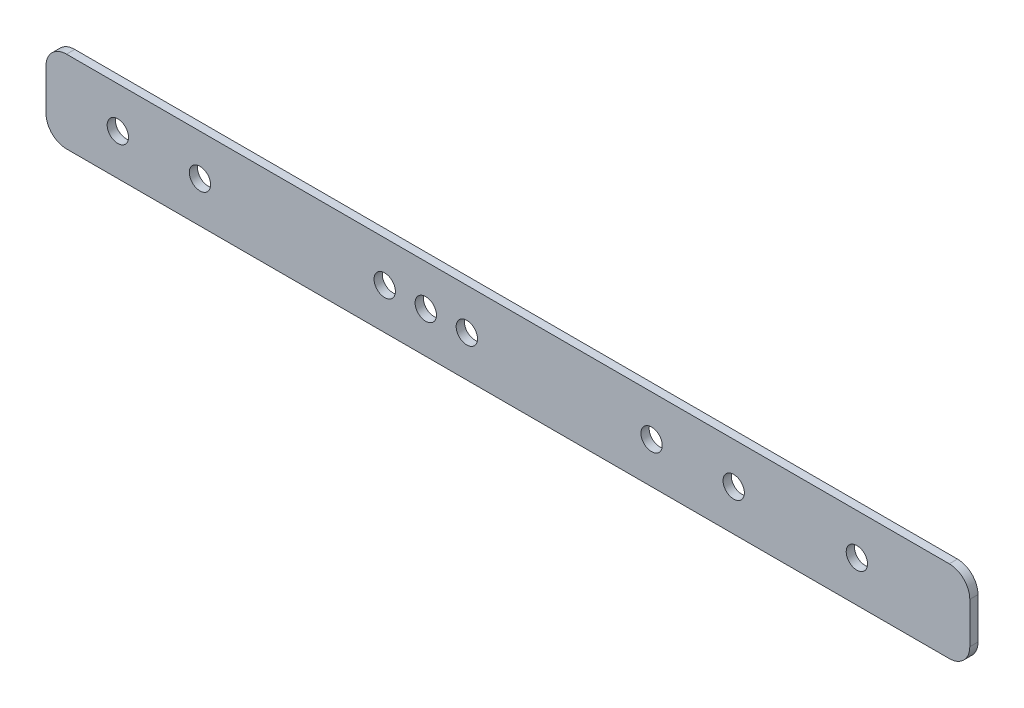
ISO-10303-21;
HEADER;
FILE_DESCRIPTION(('STEP AP214'),'2;1');
FILE_NAME('part.step','',(''),(''),'','','');
FILE_SCHEMA(('AUTOMOTIVE_DESIGN { 1 0 10303 214 1 1 1 1 }'));
ENDSEC;
DATA;
#1=APPLICATION_CONTEXT('core data for automotive mechanical design processes');
#2=APPLICATION_PROTOCOL_DEFINITION('international standard','automotive_design',2000,#1);
#3=PRODUCT_CONTEXT('',#1,'mechanical');
#4=PRODUCT('Part','Part','',(#3));
#5=PRODUCT_RELATED_PRODUCT_CATEGORY('part','',(#4));
#6=PRODUCT_DEFINITION_FORMATION('','',#4);
#7=PRODUCT_DEFINITION_CONTEXT('part definition',#1,'design');
#8=PRODUCT_DEFINITION('design','',#6,#7);
#9=PRODUCT_DEFINITION_SHAPE('','',#8);
#10=(LENGTH_UNIT() NAMED_UNIT(*) SI_UNIT(.MILLI.,.METRE.));
#11=(NAMED_UNIT(*) PLANE_ANGLE_UNIT() SI_UNIT($,.RADIAN.));
#12=(NAMED_UNIT(*) SI_UNIT($,.STERADIAN.) SOLID_ANGLE_UNIT());
#13=UNCERTAINTY_MEASURE_WITH_UNIT(LENGTH_MEASURE(1.E-05),#10,'distance_accuracy_value','');
#14=(GEOMETRIC_REPRESENTATION_CONTEXT(3) GLOBAL_UNCERTAINTY_ASSIGNED_CONTEXT((#13)) GLOBAL_UNIT_ASSIGNED_CONTEXT((#10,
#11,#12)) REPRESENTATION_CONTEXT('',''));
#15=CARTESIAN_POINT('',(0.,0.,0.));
#16=DIRECTION('',(0.,0.,1.));
#17=DIRECTION('',(1.,0.,0.));
#18=AXIS2_PLACEMENT_3D('',#15,#16,#17);
#19=CARTESIAN_POINT('',(112.5,10.,2.));
#20=DIRECTION('',(-1.,0.,0.));
#21=DIRECTION('',(0.,0.,1.));
#22=AXIS2_PLACEMENT_3D('',#19,#20,#21);
#23=PLANE('',#22);
#24=DIRECTION('',(0.,1.,0.));
#25=VECTOR('',#24,1.);
#26=CARTESIAN_POINT('',(112.5,10.,2.));
#27=LINE('',#26,#25);
#28=CARTESIAN_POINT('',(112.5,-5.,2.));
#29=VERTEX_POINT('',#28);
#30=CARTESIAN_POINT('',(112.5,5.,2.));
#31=VERTEX_POINT('',#30);
#32=EDGE_CURVE('E119',#29,#31,#27,.T.);
#33=ORIENTED_EDGE('',*,*,#32,.F.);
#34=DIRECTION('',(0.,0.,-1.));
#35=VECTOR('',#34,1.);
#36=CARTESIAN_POINT('',(112.5,-5.,2.));
#37=LINE('',#36,#35);
#38=CARTESIAN_POINT('',(112.5,-5.,0.));
#39=VERTEX_POINT('',#38);
#40=EDGE_CURVE('E104',#29,#39,#37,.T.);
#41=ORIENTED_EDGE('',*,*,#40,.T.);
#42=DIRECTION('',(0.,1.,0.));
#43=VECTOR('',#42,1.);
#44=CARTESIAN_POINT('',(112.5,10.,0.));
#45=LINE('',#44,#43);
#46=CARTESIAN_POINT('',(112.5,5.,0.));
#47=VERTEX_POINT('',#46);
#48=EDGE_CURVE('E116',#39,#47,#45,.T.);
#49=ORIENTED_EDGE('',*,*,#48,.T.);
#50=DIRECTION('',(0.,0.,-1.));
#51=VECTOR('',#50,1.);
#52=CARTESIAN_POINT('',(112.5,5.,2.));
#53=LINE('',#52,#51);
#54=EDGE_CURVE('E121',#47,#31,#53,.F.);
#55=ORIENTED_EDGE('',*,*,#54,.T.);
#56=EDGE_LOOP('',(#33,#41,#49,#55));
#57=FACE_BOUND('',#56,.T.);
#58=ADVANCED_FACE('F34',(#57),#23,.F.);
#59=CARTESIAN_POINT('',(-112.5,10.,2.));
#60=DIRECTION('',(0.,-1.,0.));
#61=DIRECTION('',(0.,0.,-1.));
#62=AXIS2_PLACEMENT_3D('',#59,#60,#61);
#63=PLANE('',#62);
#64=DIRECTION('',(-1.,0.,0.));
#65=VECTOR('',#64,1.);
#66=CARTESIAN_POINT('',(-112.5,10.,0.));
#67=LINE('',#66,#65);
#68=CARTESIAN_POINT('',(107.5,10.,0.));
#69=VERTEX_POINT('',#68);
#70=CARTESIAN_POINT('',(-107.5,10.,0.));
#71=VERTEX_POINT('',#70);
#72=EDGE_CURVE('E126',#69,#71,#67,.T.);
#73=ORIENTED_EDGE('',*,*,#72,.T.);
#74=DIRECTION('',(0.,0.,-1.));
#75=VECTOR('',#74,1.);
#76=CARTESIAN_POINT('',(-107.5,10.,2.));
#77=LINE('',#76,#75);
#78=CARTESIAN_POINT('',(-107.5,10.,2.));
#79=VERTEX_POINT('',#78);
#80=EDGE_CURVE('E11',#71,#79,#77,.F.);
#81=ORIENTED_EDGE('',*,*,#80,.T.);
#82=DIRECTION('',(-1.,0.,0.));
#83=VECTOR('',#82,1.);
#84=CARTESIAN_POINT('',(-112.5,10.,2.));
#85=LINE('',#84,#83);
#86=CARTESIAN_POINT('',(107.5,10.,2.));
#87=VERTEX_POINT('',#86);
#88=EDGE_CURVE('E165',#87,#79,#85,.T.);
#89=ORIENTED_EDGE('',*,*,#88,.F.);
#90=DIRECTION('',(0.,0.,-1.));
#91=VECTOR('',#90,1.);
#92=CARTESIAN_POINT('',(107.5,10.,2.));
#93=LINE('',#92,#91);
#94=EDGE_CURVE('E42',#87,#69,#93,.T.);
#95=ORIENTED_EDGE('',*,*,#94,.T.);
#96=EDGE_LOOP('',(#73,#81,#89,#95));
#97=FACE_BOUND('',#96,.T.);
#98=ADVANCED_FACE('F163',(#97),#63,.F.);
#99=CARTESIAN_POINT('',(-112.5,10.,2.));
#100=DIRECTION('',(1.,0.,0.));
#101=DIRECTION('',(0.,0.,-1.));
#102=AXIS2_PLACEMENT_3D('',#99,#100,#101);
#103=PLANE('',#102);
#104=DIRECTION('',(0.,-1.,0.));
#105=VECTOR('',#104,1.);
#106=CARTESIAN_POINT('',(-112.5,10.,2.));
#107=LINE('',#106,#105);
#108=CARTESIAN_POINT('',(-112.5,5.,2.));
#109=VERTEX_POINT('',#108);
#110=CARTESIAN_POINT('',(-112.5,-5.,2.));
#111=VERTEX_POINT('',#110);
#112=EDGE_CURVE('E173',#109,#111,#107,.T.);
#113=ORIENTED_EDGE('',*,*,#112,.F.);
#114=DIRECTION('',(0.,0.,-1.));
#115=VECTOR('',#114,1.);
#116=CARTESIAN_POINT('',(-112.5,5.,2.));
#117=LINE('',#116,#115);
#118=CARTESIAN_POINT('',(-112.5,5.,0.));
#119=VERTEX_POINT('',#118);
#120=EDGE_CURVE('E157',#109,#119,#117,.T.);
#121=ORIENTED_EDGE('',*,*,#120,.T.);
#122=DIRECTION('',(0.,-1.,0.));
#123=VECTOR('',#122,1.);
#124=CARTESIAN_POINT('',(-112.5,10.,0.));
#125=LINE('',#124,#123);
#126=CARTESIAN_POINT('',(-112.5,-5.,0.));
#127=VERTEX_POINT('',#126);
#128=EDGE_CURVE('E130',#119,#127,#125,.T.);
#129=ORIENTED_EDGE('',*,*,#128,.T.);
#130=DIRECTION('',(0.,0.,-1.));
#131=VECTOR('',#130,1.);
#132=CARTESIAN_POINT('',(-112.5,-5.,2.));
#133=LINE('',#132,#131);
#134=EDGE_CURVE('E49',#127,#111,#133,.F.);
#135=ORIENTED_EDGE('',*,*,#134,.T.);
#136=EDGE_LOOP('',(#113,#121,#129,#135));
#137=FACE_BOUND('',#136,.T.);
#138=ADVANCED_FACE('F172',(#137),#103,.F.);
#139=CARTESIAN_POINT('',(-112.5,-10.,2.));
#140=DIRECTION('',(0.,1.,0.));
#141=DIRECTION('',(0.,0.,1.));
#142=AXIS2_PLACEMENT_3D('',#139,#140,#141);
#143=PLANE('',#142);
#144=DIRECTION('',(1.,0.,0.));
#145=VECTOR('',#144,1.);
#146=CARTESIAN_POINT('',(-112.5,-10.,0.));
#147=LINE('',#146,#145);
#148=CARTESIAN_POINT('',(-107.5,-10.,0.));
#149=VERTEX_POINT('',#148);
#150=CARTESIAN_POINT('',(107.5,-10.,0.));
#151=VERTEX_POINT('',#150);
#152=EDGE_CURVE('E140',#149,#151,#147,.T.);
#153=ORIENTED_EDGE('',*,*,#152,.T.);
#154=DIRECTION('',(0.,0.,-1.));
#155=VECTOR('',#154,1.);
#156=CARTESIAN_POINT('',(107.5,-10.,2.));
#157=LINE('',#156,#155);
#158=CARTESIAN_POINT('',(107.5,-10.,2.));
#159=VERTEX_POINT('',#158);
#160=EDGE_CURVE('E105',#151,#159,#157,.F.);
#161=ORIENTED_EDGE('',*,*,#160,.T.);
#162=DIRECTION('',(1.,0.,0.));
#163=VECTOR('',#162,1.);
#164=CARTESIAN_POINT('',(-112.5,-10.,2.));
#165=LINE('',#164,#163);
#166=CARTESIAN_POINT('',(-107.5,-10.,2.));
#167=VERTEX_POINT('',#166);
#168=EDGE_CURVE('E136',#167,#159,#165,.T.);
#169=ORIENTED_EDGE('',*,*,#168,.F.);
#170=DIRECTION('',(0.,0.,-1.));
#171=VECTOR('',#170,1.);
#172=CARTESIAN_POINT('',(-107.5,-10.,2.));
#173=LINE('',#172,#171);
#174=EDGE_CURVE('E110',#167,#149,#173,.T.);
#175=ORIENTED_EDGE('',*,*,#174,.T.);
#176=EDGE_LOOP('',(#153,#161,#169,#175));
#177=FACE_BOUND('',#176,.T.);
#178=ADVANCED_FACE('F279',(#177),#143,.F.);
#179=CARTESIAN_POINT('',(0.,0.,2.));
#180=DIRECTION('',(0.,0.,1.));
#181=DIRECTION('',(1.,0.,0.));
#182=AXIS2_PLACEMENT_3D('',#179,#180,#181);
#183=PLANE('',#182);
#184=CARTESIAN_POINT('',(-95.,0.,2.));
#185=DIRECTION('',(0.,0.,-1.));
#186=DIRECTION('',(-1.,0.,0.));
#187=AXIS2_PLACEMENT_3D('',#184,#185,#186);
#188=CIRCLE('',#187,2.6);
#189=CARTESIAN_POINT('',(-97.6,0.,2.));
#190=VERTEX_POINT('',#189);
#191=EDGE_CURVE('E127',#190,#190,#188,.T.);
#192=ORIENTED_EDGE('',*,*,#191,.T.);
#193=EDGE_LOOP('',(#192));
#194=FACE_BOUND('',#193,.T.);
#195=CARTESIAN_POINT('',(-75.,0.,2.));
#196=DIRECTION('',(0.,0.,-1.));
#197=DIRECTION('',(-1.,0.,0.));
#198=AXIS2_PLACEMENT_3D('',#195,#196,#197);
#199=CIRCLE('',#198,2.6);
#200=CARTESIAN_POINT('',(-77.6,0.,2.));
#201=VERTEX_POINT('',#200);
#202=EDGE_CURVE('E218',#201,#201,#199,.T.);
#203=ORIENTED_EDGE('',*,*,#202,.T.);
#204=EDGE_LOOP('',(#203));
#205=FACE_BOUND('',#204,.T.);
#206=CARTESIAN_POINT('',(-30.,0.,2.));
#207=DIRECTION('',(0.,0.,-1.));
#208=DIRECTION('',(-1.,0.,0.));
#209=AXIS2_PLACEMENT_3D('',#206,#207,#208);
#210=CIRCLE('',#209,2.6);
#211=CARTESIAN_POINT('',(-32.6,0.,2.));
#212=VERTEX_POINT('',#211);
#213=EDGE_CURVE('E212',#212,#212,#210,.T.);
#214=ORIENTED_EDGE('',*,*,#213,.T.);
#215=EDGE_LOOP('',(#214));
#216=FACE_BOUND('',#215,.T.);
#217=CARTESIAN_POINT('',(-20.,0.,2.));
#218=DIRECTION('',(0.,0.,-1.));
#219=DIRECTION('',(-1.,0.,0.));
#220=AXIS2_PLACEMENT_3D('',#217,#218,#219);
#221=CIRCLE('',#220,2.6);
#222=CARTESIAN_POINT('',(-22.6,0.,2.));
#223=VERTEX_POINT('',#222);
#224=EDGE_CURVE('E206',#223,#223,#221,.T.);
#225=ORIENTED_EDGE('',*,*,#224,.T.);
#226=EDGE_LOOP('',(#225));
#227=FACE_BOUND('',#226,.T.);
#228=CARTESIAN_POINT('',(-9.99999999999997,0.,2.));
#229=DIRECTION('',(0.,0.,-1.));
#230=DIRECTION('',(-1.,0.,0.));
#231=AXIS2_PLACEMENT_3D('',#228,#229,#230);
#232=CIRCLE('',#231,2.6);
#233=CARTESIAN_POINT('',(-12.6,0.,2.));
#234=VERTEX_POINT('',#233);
#235=EDGE_CURVE('E200',#234,#234,#232,.T.);
#236=ORIENTED_EDGE('',*,*,#235,.T.);
#237=EDGE_LOOP('',(#236));
#238=FACE_BOUND('',#237,.T.);
#239=CARTESIAN_POINT('',(35.0000000000001,0.,2.));
#240=DIRECTION('',(0.,0.,-1.));
#241=DIRECTION('',(-1.,0.,0.));
#242=AXIS2_PLACEMENT_3D('',#239,#240,#241);
#243=CIRCLE('',#242,2.6);
#244=CARTESIAN_POINT('',(32.4000000000001,0.,2.));
#245=VERTEX_POINT('',#244);
#246=EDGE_CURVE('E194',#245,#245,#243,.T.);
#247=ORIENTED_EDGE('',*,*,#246,.T.);
#248=EDGE_LOOP('',(#247));
#249=FACE_BOUND('',#248,.T.);
#250=CARTESIAN_POINT('',(55.0000000000001,0.,2.));
#251=DIRECTION('',(0.,0.,-1.));
#252=DIRECTION('',(-1.,0.,0.));
#253=AXIS2_PLACEMENT_3D('',#250,#251,#252);
#254=CIRCLE('',#253,2.6);
#255=CARTESIAN_POINT('',(52.4000000000001,0.,2.));
#256=VERTEX_POINT('',#255);
#257=EDGE_CURVE('E188',#256,#256,#254,.T.);
#258=ORIENTED_EDGE('',*,*,#257,.T.);
#259=EDGE_LOOP('',(#258));
#260=FACE_BOUND('',#259,.T.);
#261=CARTESIAN_POINT('',(85.0000000000001,0.,2.));
#262=DIRECTION('',(0.,0.,-1.));
#263=DIRECTION('',(-1.,0.,0.));
#264=AXIS2_PLACEMENT_3D('',#261,#262,#263);
#265=CIRCLE('',#264,2.59999999999999);
#266=CARTESIAN_POINT('',(82.4000000000001,0.,2.));
#267=VERTEX_POINT('',#266);
#268=EDGE_CURVE('E182',#267,#267,#265,.T.);
#269=ORIENTED_EDGE('',*,*,#268,.T.);
#270=EDGE_LOOP('',(#269));
#271=FACE_BOUND('',#270,.T.);
#272=ORIENTED_EDGE('',*,*,#168,.T.);
#273=CARTESIAN_POINT('',(107.5,-5.,2.));
#274=DIRECTION('',(0.,0.,1.));
#275=DIRECTION('',(1.,0.,0.));
#276=AXIS2_PLACEMENT_3D('',#273,#274,#275);
#277=CIRCLE('',#276,5.);
#278=EDGE_CURVE('E154',#159,#29,#277,.T.);
#279=ORIENTED_EDGE('',*,*,#278,.T.);
#280=ORIENTED_EDGE('',*,*,#32,.T.);
#281=CARTESIAN_POINT('',(107.5,5.,2.));
#282=DIRECTION('',(0.,0.,1.));
#283=DIRECTION('',(1.,0.,0.));
#284=AXIS2_PLACEMENT_3D('',#281,#282,#283);
#285=CIRCLE('',#284,5.);
#286=EDGE_CURVE('E151',#31,#87,#285,.T.);
#287=ORIENTED_EDGE('',*,*,#286,.T.);
#288=ORIENTED_EDGE('',*,*,#88,.T.);
#289=CARTESIAN_POINT('',(-107.5,5.,2.));
#290=DIRECTION('',(0.,0.,1.));
#291=DIRECTION('',(1.,0.,0.));
#292=AXIS2_PLACEMENT_3D('',#289,#290,#291);
#293=CIRCLE('',#292,5.);
#294=EDGE_CURVE('E56',#79,#109,#293,.T.);
#295=ORIENTED_EDGE('',*,*,#294,.T.);
#296=ORIENTED_EDGE('',*,*,#112,.T.);
#297=CARTESIAN_POINT('',(-107.5,-5.,2.));
#298=DIRECTION('',(0.,0.,1.));
#299=DIRECTION('',(1.,0.,0.));
#300=AXIS2_PLACEMENT_3D('',#297,#298,#299);
#301=CIRCLE('',#300,5.);
#302=EDGE_CURVE('E149',#111,#167,#301,.T.);
#303=ORIENTED_EDGE('',*,*,#302,.T.);
#304=EDGE_LOOP('',(#272,#279,#280,#287,#288,#295,#296,#303));
#305=FACE_BOUND('',#304,.T.);
#306=ADVANCED_FACE('F229',(#194,#205,#216,#227,#238,#249,#260,#271,#305),#183,.T.);
#307=CARTESIAN_POINT('',(0.,0.,0.));
#308=DIRECTION('',(0.,0.,1.));
#309=DIRECTION('',(1.,0.,0.));
#310=AXIS2_PLACEMENT_3D('',#307,#308,#309);
#311=PLANE('',#310);
#312=CARTESIAN_POINT('',(-95.,0.,0.));
#313=DIRECTION('',(0.,0.,-1.));
#314=DIRECTION('',(-1.,0.,0.));
#315=AXIS2_PLACEMENT_3D('',#312,#313,#314);
#316=CIRCLE('',#315,2.6);
#317=CARTESIAN_POINT('',(-97.6,0.,0.));
#318=VERTEX_POINT('',#317);
#319=EDGE_CURVE('E133',#318,#318,#316,.T.);
#320=ORIENTED_EDGE('',*,*,#319,.F.);
#321=EDGE_LOOP('',(#320));
#322=FACE_BOUND('',#321,.T.);
#323=CARTESIAN_POINT('',(-75.,0.,0.));
#324=DIRECTION('',(0.,0.,-1.));
#325=DIRECTION('',(-1.,0.,0.));
#326=AXIS2_PLACEMENT_3D('',#323,#324,#325);
#327=CIRCLE('',#326,2.6);
#328=CARTESIAN_POINT('',(-77.6,0.,0.));
#329=VERTEX_POINT('',#328);
#330=EDGE_CURVE('E215',#329,#329,#327,.T.);
#331=ORIENTED_EDGE('',*,*,#330,.F.);
#332=EDGE_LOOP('',(#331));
#333=FACE_BOUND('',#332,.T.);
#334=CARTESIAN_POINT('',(-30.,0.,0.));
#335=DIRECTION('',(0.,0.,-1.));
#336=DIRECTION('',(-1.,0.,0.));
#337=AXIS2_PLACEMENT_3D('',#334,#335,#336);
#338=CIRCLE('',#337,2.6);
#339=CARTESIAN_POINT('',(-32.6,0.,0.));
#340=VERTEX_POINT('',#339);
#341=EDGE_CURVE('E209',#340,#340,#338,.T.);
#342=ORIENTED_EDGE('',*,*,#341,.F.);
#343=EDGE_LOOP('',(#342));
#344=FACE_BOUND('',#343,.T.);
#345=CARTESIAN_POINT('',(-20.,0.,0.));
#346=DIRECTION('',(0.,0.,-1.));
#347=DIRECTION('',(-1.,0.,0.));
#348=AXIS2_PLACEMENT_3D('',#345,#346,#347);
#349=CIRCLE('',#348,2.6);
#350=CARTESIAN_POINT('',(-22.6,0.,0.));
#351=VERTEX_POINT('',#350);
#352=EDGE_CURVE('E203',#351,#351,#349,.T.);
#353=ORIENTED_EDGE('',*,*,#352,.F.);
#354=EDGE_LOOP('',(#353));
#355=FACE_BOUND('',#354,.T.);
#356=CARTESIAN_POINT('',(-9.99999999999997,0.,0.));
#357=DIRECTION('',(0.,0.,-1.));
#358=DIRECTION('',(-1.,0.,0.));
#359=AXIS2_PLACEMENT_3D('',#356,#357,#358);
#360=CIRCLE('',#359,2.6);
#361=CARTESIAN_POINT('',(-12.6,0.,0.));
#362=VERTEX_POINT('',#361);
#363=EDGE_CURVE('E197',#362,#362,#360,.T.);
#364=ORIENTED_EDGE('',*,*,#363,.F.);
#365=EDGE_LOOP('',(#364));
#366=FACE_BOUND('',#365,.T.);
#367=CARTESIAN_POINT('',(35.0000000000001,0.,0.));
#368=DIRECTION('',(0.,0.,-1.));
#369=DIRECTION('',(-1.,0.,0.));
#370=AXIS2_PLACEMENT_3D('',#367,#368,#369);
#371=CIRCLE('',#370,2.6);
#372=CARTESIAN_POINT('',(32.4000000000001,0.,0.));
#373=VERTEX_POINT('',#372);
#374=EDGE_CURVE('E191',#373,#373,#371,.T.);
#375=ORIENTED_EDGE('',*,*,#374,.F.);
#376=EDGE_LOOP('',(#375));
#377=FACE_BOUND('',#376,.T.);
#378=CARTESIAN_POINT('',(55.0000000000001,0.,0.));
#379=DIRECTION('',(0.,0.,-1.));
#380=DIRECTION('',(-1.,0.,0.));
#381=AXIS2_PLACEMENT_3D('',#378,#379,#380);
#382=CIRCLE('',#381,2.6);
#383=CARTESIAN_POINT('',(52.4000000000001,0.,0.));
#384=VERTEX_POINT('',#383);
#385=EDGE_CURVE('E185',#384,#384,#382,.T.);
#386=ORIENTED_EDGE('',*,*,#385,.F.);
#387=EDGE_LOOP('',(#386));
#388=FACE_BOUND('',#387,.T.);
#389=CARTESIAN_POINT('',(85.0000000000001,0.,0.));
#390=DIRECTION('',(0.,0.,-1.));
#391=DIRECTION('',(-1.,0.,0.));
#392=AXIS2_PLACEMENT_3D('',#389,#390,#391);
#393=CIRCLE('',#392,2.59999999999999);
#394=CARTESIAN_POINT('',(82.4000000000001,0.,0.));
#395=VERTEX_POINT('',#394);
#396=EDGE_CURVE('E179',#395,#395,#393,.T.);
#397=ORIENTED_EDGE('',*,*,#396,.F.);
#398=EDGE_LOOP('',(#397));
#399=FACE_BOUND('',#398,.T.);
#400=ORIENTED_EDGE('',*,*,#48,.F.);
#401=CARTESIAN_POINT('',(107.5,-5.,0.));
#402=DIRECTION('',(0.,0.,1.));
#403=DIRECTION('',(1.,0.,0.));
#404=AXIS2_PLACEMENT_3D('',#401,#402,#403);
#405=CIRCLE('',#404,5.);
#406=EDGE_CURVE('E100',#39,#151,#405,.F.);
#407=ORIENTED_EDGE('',*,*,#406,.T.);
#408=ORIENTED_EDGE('',*,*,#152,.F.);
#409=CARTESIAN_POINT('',(-107.5,-5.,0.));
#410=DIRECTION('',(0.,0.,1.));
#411=DIRECTION('',(1.,0.,0.));
#412=AXIS2_PLACEMENT_3D('',#409,#410,#411);
#413=CIRCLE('',#412,5.);
#414=EDGE_CURVE('E120',#149,#127,#413,.F.);
#415=ORIENTED_EDGE('',*,*,#414,.T.);
#416=ORIENTED_EDGE('',*,*,#128,.F.);
#417=CARTESIAN_POINT('',(-107.5,5.,0.));
#418=DIRECTION('',(0.,0.,1.));
#419=DIRECTION('',(1.,0.,0.));
#420=AXIS2_PLACEMENT_3D('',#417,#418,#419);
#421=CIRCLE('',#420,5.);
#422=EDGE_CURVE('E111',#119,#71,#421,.F.);
#423=ORIENTED_EDGE('',*,*,#422,.T.);
#424=ORIENTED_EDGE('',*,*,#72,.F.);
#425=CARTESIAN_POINT('',(107.5,5.,0.));
#426=DIRECTION('',(0.,0.,1.));
#427=DIRECTION('',(1.,0.,0.));
#428=AXIS2_PLACEMENT_3D('',#425,#426,#427);
#429=CIRCLE('',#428,5.);
#430=EDGE_CURVE('E125',#69,#47,#429,.F.);
#431=ORIENTED_EDGE('',*,*,#430,.T.);
#432=EDGE_LOOP('',(#400,#407,#408,#415,#416,#423,#424,#431));
#433=FACE_BOUND('',#432,.T.);
#434=ADVANCED_FACE('F123',(#322,#333,#344,#355,#366,#377,#388,#399,#433),#311,.F.);
#435=CARTESIAN_POINT('',(85.0000000000001,0.,2.));
#436=DIRECTION('',(0.,0.,-1.));
#437=DIRECTION('',(-1.,0.,0.));
#438=AXIS2_PLACEMENT_3D('',#435,#436,#437);
#439=CYLINDRICAL_SURFACE('',#438,2.59999999999999);
#440=ORIENTED_EDGE('',*,*,#268,.F.);
#441=EDGE_LOOP('',(#440));
#442=FACE_BOUND('',#441,.T.);
#443=ORIENTED_EDGE('',*,*,#396,.T.);
#444=EDGE_LOOP('',(#443));
#445=FACE_BOUND('',#444,.T.);
#446=ADVANCED_FACE('F228',(#442,#445),#439,.F.);
#447=CARTESIAN_POINT('',(55.0000000000001,0.,2.));
#448=DIRECTION('',(0.,0.,-1.));
#449=DIRECTION('',(-1.,0.,0.));
#450=AXIS2_PLACEMENT_3D('',#447,#448,#449);
#451=CYLINDRICAL_SURFACE('',#450,2.6);
#452=ORIENTED_EDGE('',*,*,#257,.F.);
#453=EDGE_LOOP('',(#452));
#454=FACE_BOUND('',#453,.T.);
#455=ORIENTED_EDGE('',*,*,#385,.T.);
#456=EDGE_LOOP('',(#455));
#457=FACE_BOUND('',#456,.T.);
#458=ADVANCED_FACE('F246',(#454,#457),#451,.F.);
#459=CARTESIAN_POINT('',(35.0000000000001,0.,2.));
#460=DIRECTION('',(0.,0.,-1.));
#461=DIRECTION('',(-1.,0.,0.));
#462=AXIS2_PLACEMENT_3D('',#459,#460,#461);
#463=CYLINDRICAL_SURFACE('',#462,2.6);
#464=ORIENTED_EDGE('',*,*,#246,.F.);
#465=EDGE_LOOP('',(#464));
#466=FACE_BOUND('',#465,.T.);
#467=ORIENTED_EDGE('',*,*,#374,.T.);
#468=EDGE_LOOP('',(#467));
#469=FACE_BOUND('',#468,.T.);
#470=ADVANCED_FACE('F253',(#466,#469),#463,.F.);
#471=CARTESIAN_POINT('',(-9.99999999999997,0.,2.));
#472=DIRECTION('',(0.,0.,-1.));
#473=DIRECTION('',(-1.,0.,0.));
#474=AXIS2_PLACEMENT_3D('',#471,#472,#473);
#475=CYLINDRICAL_SURFACE('',#474,2.6);
#476=ORIENTED_EDGE('',*,*,#235,.F.);
#477=EDGE_LOOP('',(#476));
#478=FACE_BOUND('',#477,.T.);
#479=ORIENTED_EDGE('',*,*,#363,.T.);
#480=EDGE_LOOP('',(#479));
#481=FACE_BOUND('',#480,.T.);
#482=ADVANCED_FACE('F331',(#478,#481),#475,.F.);
#483=CARTESIAN_POINT('',(-20.,0.,2.));
#484=DIRECTION('',(0.,0.,-1.));
#485=DIRECTION('',(-1.,0.,0.));
#486=AXIS2_PLACEMENT_3D('',#483,#484,#485);
#487=CYLINDRICAL_SURFACE('',#486,2.6);
#488=ORIENTED_EDGE('',*,*,#224,.F.);
#489=EDGE_LOOP('',(#488));
#490=FACE_BOUND('',#489,.T.);
#491=ORIENTED_EDGE('',*,*,#352,.T.);
#492=EDGE_LOOP('',(#491));
#493=FACE_BOUND('',#492,.T.);
#494=ADVANCED_FACE('F340',(#490,#493),#487,.F.);
#495=CARTESIAN_POINT('',(-30.,0.,2.));
#496=DIRECTION('',(0.,0.,-1.));
#497=DIRECTION('',(-1.,0.,0.));
#498=AXIS2_PLACEMENT_3D('',#495,#496,#497);
#499=CYLINDRICAL_SURFACE('',#498,2.6);
#500=ORIENTED_EDGE('',*,*,#213,.F.);
#501=EDGE_LOOP('',(#500));
#502=FACE_BOUND('',#501,.T.);
#503=ORIENTED_EDGE('',*,*,#341,.T.);
#504=EDGE_LOOP('',(#503));
#505=FACE_BOUND('',#504,.T.);
#506=ADVANCED_FACE('F349',(#502,#505),#499,.F.);
#507=CARTESIAN_POINT('',(-75.,0.,2.));
#508=DIRECTION('',(0.,0.,-1.));
#509=DIRECTION('',(-1.,0.,0.));
#510=AXIS2_PLACEMENT_3D('',#507,#508,#509);
#511=CYLINDRICAL_SURFACE('',#510,2.6);
#512=ORIENTED_EDGE('',*,*,#202,.F.);
#513=EDGE_LOOP('',(#512));
#514=FACE_BOUND('',#513,.T.);
#515=ORIENTED_EDGE('',*,*,#330,.T.);
#516=EDGE_LOOP('',(#515));
#517=FACE_BOUND('',#516,.T.);
#518=ADVANCED_FACE('F358',(#514,#517),#511,.F.);
#519=CARTESIAN_POINT('',(-95.,0.,2.));
#520=DIRECTION('',(0.,0.,-1.));
#521=DIRECTION('',(-1.,0.,0.));
#522=AXIS2_PLACEMENT_3D('',#519,#520,#521);
#523=CYLINDRICAL_SURFACE('',#522,2.6);
#524=ORIENTED_EDGE('',*,*,#191,.F.);
#525=EDGE_LOOP('',(#524));
#526=FACE_BOUND('',#525,.T.);
#527=ORIENTED_EDGE('',*,*,#319,.T.);
#528=EDGE_LOOP('',(#527));
#529=FACE_BOUND('',#528,.T.);
#530=ADVANCED_FACE('F224',(#526,#529),#523,.F.);
#531=CARTESIAN_POINT('',(107.5,-5.,2.));
#532=DIRECTION('',(0.,0.,-1.));
#533=DIRECTION('',(-1.,0.,0.));
#534=AXIS2_PLACEMENT_3D('',#531,#532,#533);
#535=CYLINDRICAL_SURFACE('',#534,5.);
#536=ORIENTED_EDGE('',*,*,#278,.F.);
#537=ORIENTED_EDGE('',*,*,#160,.F.);
#538=ORIENTED_EDGE('',*,*,#406,.F.);
#539=ORIENTED_EDGE('',*,*,#40,.F.);
#540=EDGE_LOOP('',(#536,#537,#538,#539));
#541=FACE_BOUND('',#540,.T.);
#542=ADVANCED_FACE('F103',(#541),#535,.T.);
#543=CARTESIAN_POINT('',(-107.5,5.,2.));
#544=DIRECTION('',(0.,0.,-1.));
#545=DIRECTION('',(-1.,0.,0.));
#546=AXIS2_PLACEMENT_3D('',#543,#544,#545);
#547=CYLINDRICAL_SURFACE('',#546,5.);
#548=ORIENTED_EDGE('',*,*,#294,.F.);
#549=ORIENTED_EDGE('',*,*,#80,.F.);
#550=ORIENTED_EDGE('',*,*,#422,.F.);
#551=ORIENTED_EDGE('',*,*,#120,.F.);
#552=EDGE_LOOP('',(#548,#549,#550,#551));
#553=FACE_BOUND('',#552,.T.);
#554=ADVANCED_FACE('F171',(#553),#547,.T.);
#555=CARTESIAN_POINT('',(107.5,5.,2.));
#556=DIRECTION('',(0.,0.,-1.));
#557=DIRECTION('',(-1.,0.,0.));
#558=AXIS2_PLACEMENT_3D('',#555,#556,#557);
#559=CYLINDRICAL_SURFACE('',#558,5.);
#560=ORIENTED_EDGE('',*,*,#286,.F.);
#561=ORIENTED_EDGE('',*,*,#54,.F.);
#562=ORIENTED_EDGE('',*,*,#430,.F.);
#563=ORIENTED_EDGE('',*,*,#94,.F.);
#564=EDGE_LOOP('',(#560,#561,#562,#563));
#565=FACE_BOUND('',#564,.T.);
#566=ADVANCED_FACE('F270',(#565),#559,.T.);
#567=CARTESIAN_POINT('',(-107.5,-5.,2.));
#568=DIRECTION('',(0.,0.,-1.));
#569=DIRECTION('',(-1.,0.,0.));
#570=AXIS2_PLACEMENT_3D('',#567,#568,#569);
#571=CYLINDRICAL_SURFACE('',#570,5.);
#572=ORIENTED_EDGE('',*,*,#302,.F.);
#573=ORIENTED_EDGE('',*,*,#134,.F.);
#574=ORIENTED_EDGE('',*,*,#414,.F.);
#575=ORIENTED_EDGE('',*,*,#174,.F.);
#576=EDGE_LOOP('',(#572,#573,#574,#575));
#577=FACE_BOUND('',#576,.T.);
#578=ADVANCED_FACE('F36',(#577),#571,.T.);
#579=CLOSED_SHELL('',(#58,#98,#138,#178,#306,#434,#446,#458,#470,#482,#494,#506,#518,#530,#542,
#554,#566,#578));
#580=MANIFOLD_SOLID_BREP('B2',#579);
#581=ADVANCED_BREP_SHAPE_REPRESENTATION('',(#18,#580),#14);
#582=SHAPE_DEFINITION_REPRESENTATION(#9,#581);
ENDSEC;
END-ISO-10303-21;
